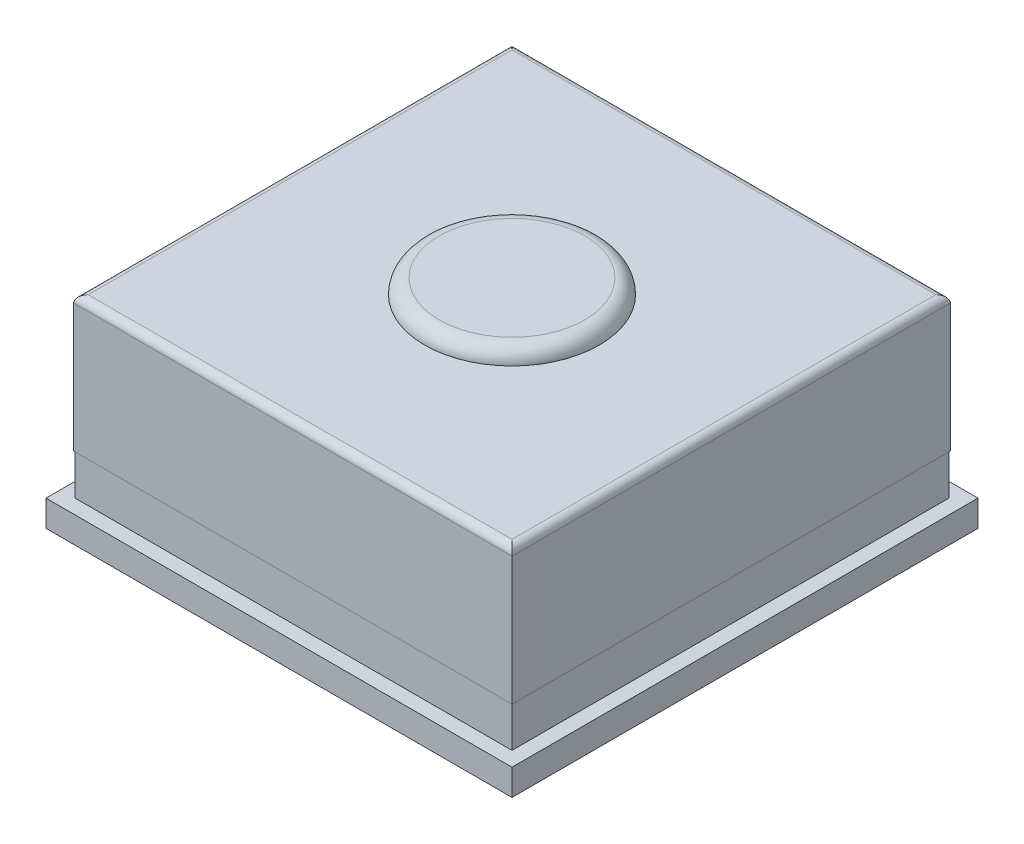
ISO-10303-21;
HEADER;
FILE_DESCRIPTION(('STEP AP214'),'2;1');
FILE_NAME('part.step','',(''),(''),'','','');
FILE_SCHEMA(('AUTOMOTIVE_DESIGN { 1 0 10303 214 1 1 1 1 }'));
ENDSEC;
DATA;
#1=APPLICATION_CONTEXT('core data for automotive mechanical design processes');
#2=APPLICATION_PROTOCOL_DEFINITION('international standard','automotive_design',2000,#1);
#3=PRODUCT_CONTEXT('',#1,'mechanical');
#4=PRODUCT('Part','Part','',(#3));
#5=PRODUCT_RELATED_PRODUCT_CATEGORY('part','',(#4));
#6=PRODUCT_DEFINITION_FORMATION('','',#4);
#7=PRODUCT_DEFINITION_CONTEXT('part definition',#1,'design');
#8=PRODUCT_DEFINITION('design','',#6,#7);
#9=PRODUCT_DEFINITION_SHAPE('','',#8);
#10=(LENGTH_UNIT() NAMED_UNIT(*) SI_UNIT(.MILLI.,.METRE.));
#11=(NAMED_UNIT(*) PLANE_ANGLE_UNIT() SI_UNIT($,.RADIAN.));
#12=(NAMED_UNIT(*) SI_UNIT($,.STERADIAN.) SOLID_ANGLE_UNIT());
#13=UNCERTAINTY_MEASURE_WITH_UNIT(LENGTH_MEASURE(1.E-05),#10,'distance_accuracy_value','');
#14=(GEOMETRIC_REPRESENTATION_CONTEXT(3) GLOBAL_UNCERTAINTY_ASSIGNED_CONTEXT((#13)) GLOBAL_UNIT_ASSIGNED_CONTEXT((#10,
#11,#12)) REPRESENTATION_CONTEXT('',''));
#15=CARTESIAN_POINT('',(0.,0.,0.));
#16=DIRECTION('',(0.,0.,1.));
#17=DIRECTION('',(1.,0.,0.));
#18=AXIS2_PLACEMENT_3D('',#15,#16,#17);
#19=CARTESIAN_POINT('',(0.,6.95,0.));
#20=DIRECTION('',(0.,-1.,0.));
#21=DIRECTION('',(0.,0.,-1.));
#22=AXIS2_PLACEMENT_3D('',#19,#20,#21);
#23=PLANE('',#22);
#24=DIRECTION('',(0.,0.,1.));
#25=VECTOR('',#24,1.);
#26=CARTESIAN_POINT('',(-7.275,6.95,0.));
#27=LINE('',#26,#25);
#28=CARTESIAN_POINT('',(-7.275,6.95,-7.275));
#29=VERTEX_POINT('',#28);
#30=CARTESIAN_POINT('',(-7.275,6.95,7.275));
#31=VERTEX_POINT('',#30);
#32=EDGE_CURVE('E238',#29,#31,#27,.T.);
#33=ORIENTED_EDGE('',*,*,#32,.T.);
#34=DIRECTION('',(1.,0.,0.));
#35=VECTOR('',#34,1.);
#36=CARTESIAN_POINT('',(0.,6.95,7.275));
#37=LINE('',#36,#35);
#38=CARTESIAN_POINT('',(7.275,6.95,7.275));
#39=VERTEX_POINT('',#38);
#40=EDGE_CURVE('E244',#31,#39,#37,.T.);
#41=ORIENTED_EDGE('',*,*,#40,.T.);
#42=DIRECTION('',(0.,0.,-1.));
#43=VECTOR('',#42,1.);
#44=CARTESIAN_POINT('',(7.275,6.95,0.));
#45=LINE('',#44,#43);
#46=CARTESIAN_POINT('',(7.275,6.95,-7.275));
#47=VERTEX_POINT('',#46);
#48=EDGE_CURVE('E242',#39,#47,#45,.T.);
#49=ORIENTED_EDGE('',*,*,#48,.T.);
#50=DIRECTION('',(-1.,0.,0.));
#51=VECTOR('',#50,1.);
#52=CARTESIAN_POINT('',(0.,6.95,-7.275));
#53=LINE('',#52,#51);
#54=EDGE_CURVE('E240',#47,#29,#53,.T.);
#55=ORIENTED_EDGE('',*,*,#54,.T.);
#56=EDGE_LOOP('',(#33,#41,#49,#55));
#57=FACE_BOUND('',#56,.T.);
#58=CARTESIAN_POINT('',(0.,6.95,0.));
#59=DIRECTION('',(0.,-1.,0.));
#60=DIRECTION('',(0.,0.,-1.));
#61=AXIS2_PLACEMENT_3D('',#58,#59,#60);
#62=CIRCLE('',#61,3.);
#63=CARTESIAN_POINT('',(0.,6.95,-3.));
#64=VERTEX_POINT('',#63);
#65=EDGE_CURVE('E232',#64,#64,#62,.F.);
#66=ORIENTED_EDGE('',*,*,#65,.F.);
#67=EDGE_LOOP('',(#66));
#68=FACE_BOUND('',#67,.T.);
#69=ADVANCED_FACE('F33',(#57,#68),#23,.F.);
#70=CARTESIAN_POINT('',(0.,0.9,0.));
#71=DIRECTION('',(0.,-1.,0.));
#72=DIRECTION('',(0.,0.,-1.));
#73=AXIS2_PLACEMENT_3D('',#70,#71,#72);
#74=PLANE('',#73);
#75=DIRECTION('',(0.,0.,-1.));
#76=VECTOR('',#75,1.);
#77=CARTESIAN_POINT('',(8.,0.9,8.));
#78=LINE('',#77,#76);
#79=CARTESIAN_POINT('',(8.,0.9,8.));
#80=VERTEX_POINT('',#79);
#81=CARTESIAN_POINT('',(8.,0.9,-8.));
#82=VERTEX_POINT('',#81);
#83=EDGE_CURVE('E203',#80,#82,#78,.T.);
#84=ORIENTED_EDGE('',*,*,#83,.T.);
#85=DIRECTION('',(-1.,0.,0.));
#86=VECTOR('',#85,1.);
#87=CARTESIAN_POINT('',(-8.,0.9,-8.));
#88=LINE('',#87,#86);
#89=CARTESIAN_POINT('',(-8.,0.9,-8.));
#90=VERTEX_POINT('',#89);
#91=EDGE_CURVE('E206',#82,#90,#88,.T.);
#92=ORIENTED_EDGE('',*,*,#91,.T.);
#93=DIRECTION('',(0.,0.,1.));
#94=VECTOR('',#93,1.);
#95=CARTESIAN_POINT('',(-8.,0.9,8.));
#96=LINE('',#95,#94);
#97=CARTESIAN_POINT('',(-8.,0.9,8.));
#98=VERTEX_POINT('',#97);
#99=EDGE_CURVE('E209',#90,#98,#96,.T.);
#100=ORIENTED_EDGE('',*,*,#99,.T.);
#101=DIRECTION('',(1.,0.,0.));
#102=VECTOR('',#101,1.);
#103=CARTESIAN_POINT('',(-8.,0.9,8.));
#104=LINE('',#103,#102);
#105=EDGE_CURVE('E211',#98,#80,#104,.T.);
#106=ORIENTED_EDGE('',*,*,#105,.T.);
#107=EDGE_LOOP('',(#84,#92,#100,#106));
#108=FACE_BOUND('',#107,.T.);
#109=DIRECTION('',(0.,0.,-1.));
#110=VECTOR('',#109,1.);
#111=CARTESIAN_POINT('',(7.5,0.9,0.));
#112=LINE('',#111,#110);
#113=CARTESIAN_POINT('',(7.5,0.9,7.5));
#114=VERTEX_POINT('',#113);
#115=CARTESIAN_POINT('',(7.5,0.9,-7.5));
#116=VERTEX_POINT('',#115);
#117=EDGE_CURVE('E199',#114,#116,#112,.T.);
#118=ORIENTED_EDGE('',*,*,#117,.F.);
#119=DIRECTION('',(1.,0.,0.));
#120=VECTOR('',#119,1.);
#121=CARTESIAN_POINT('',(0.,0.9,7.5));
#122=LINE('',#121,#120);
#123=CARTESIAN_POINT('',(-7.5,0.9,7.5));
#124=VERTEX_POINT('',#123);
#125=EDGE_CURVE('E190',#124,#114,#122,.T.);
#126=ORIENTED_EDGE('',*,*,#125,.F.);
#127=DIRECTION('',(0.,0.,1.));
#128=VECTOR('',#127,1.);
#129=CARTESIAN_POINT('',(-7.5,0.9,0.));
#130=LINE('',#129,#128);
#131=CARTESIAN_POINT('',(-7.5,0.9,-7.5));
#132=VERTEX_POINT('',#131);
#133=EDGE_CURVE('E193',#132,#124,#130,.T.);
#134=ORIENTED_EDGE('',*,*,#133,.F.);
#135=DIRECTION('',(-1.,0.,0.));
#136=VECTOR('',#135,1.);
#137=CARTESIAN_POINT('',(0.,0.9,-7.5));
#138=LINE('',#137,#136);
#139=EDGE_CURVE('E196',#116,#132,#138,.T.);
#140=ORIENTED_EDGE('',*,*,#139,.F.);
#141=EDGE_LOOP('',(#118,#126,#134,#140));
#142=FACE_BOUND('',#141,.T.);
#143=ADVANCED_FACE('F286',(#108,#142),#74,.F.);
#144=CARTESIAN_POINT('',(8.,0.9,8.));
#145=DIRECTION('',(-1.,0.,0.));
#146=DIRECTION('',(0.,0.,1.));
#147=AXIS2_PLACEMENT_3D('',#144,#145,#146);
#148=PLANE('',#147);
#149=DIRECTION('',(0.,0.,-1.));
#150=VECTOR('',#149,1.);
#151=CARTESIAN_POINT('',(8.,0.,8.));
#152=LINE('',#151,#150);
#153=CARTESIAN_POINT('',(8.,0.,8.));
#154=VERTEX_POINT('',#153);
#155=CARTESIAN_POINT('',(8.,0.,-8.));
#156=VERTEX_POINT('',#155);
#157=EDGE_CURVE('E202',#154,#156,#152,.T.);
#158=ORIENTED_EDGE('',*,*,#157,.T.);
#159=DIRECTION('',(0.,-1.,0.));
#160=VECTOR('',#159,1.);
#161=CARTESIAN_POINT('',(8.,0.9,-8.));
#162=LINE('',#161,#160);
#163=EDGE_CURVE('E229',#82,#156,#162,.T.);
#164=ORIENTED_EDGE('',*,*,#163,.F.);
#165=ORIENTED_EDGE('',*,*,#83,.F.);
#166=DIRECTION('',(0.,-1.,0.));
#167=VECTOR('',#166,1.);
#168=CARTESIAN_POINT('',(8.,0.9,8.));
#169=LINE('',#168,#167);
#170=EDGE_CURVE('E213',#80,#154,#169,.T.);
#171=ORIENTED_EDGE('',*,*,#170,.T.);
#172=EDGE_LOOP('',(#158,#164,#165,#171));
#173=FACE_BOUND('',#172,.T.);
#174=ADVANCED_FACE('F291',(#173),#148,.F.);
#175=CARTESIAN_POINT('',(-8.,0.9,-8.));
#176=DIRECTION('',(0.,0.,1.));
#177=DIRECTION('',(1.,0.,0.));
#178=AXIS2_PLACEMENT_3D('',#175,#176,#177);
#179=PLANE('',#178);
#180=DIRECTION('',(-1.,0.,0.));
#181=VECTOR('',#180,1.);
#182=CARTESIAN_POINT('',(-8.,0.,-8.));
#183=LINE('',#182,#181);
#184=CARTESIAN_POINT('',(-8.,0.,-8.));
#185=VERTEX_POINT('',#184);
#186=EDGE_CURVE('E216',#156,#185,#183,.T.);
#187=ORIENTED_EDGE('',*,*,#186,.T.);
#188=DIRECTION('',(0.,-1.,0.));
#189=VECTOR('',#188,1.);
#190=CARTESIAN_POINT('',(-8.,0.9,-8.));
#191=LINE('',#190,#189);
#192=EDGE_CURVE('E226',#90,#185,#191,.T.);
#193=ORIENTED_EDGE('',*,*,#192,.F.);
#194=ORIENTED_EDGE('',*,*,#91,.F.);
#195=ORIENTED_EDGE('',*,*,#163,.T.);
#196=EDGE_LOOP('',(#187,#193,#194,#195));
#197=FACE_BOUND('',#196,.T.);
#198=ADVANCED_FACE('F331',(#197),#179,.F.);
#199=CARTESIAN_POINT('',(-8.,0.9,8.));
#200=DIRECTION('',(1.,0.,0.));
#201=DIRECTION('',(0.,0.,-1.));
#202=AXIS2_PLACEMENT_3D('',#199,#200,#201);
#203=PLANE('',#202);
#204=DIRECTION('',(0.,0.,1.));
#205=VECTOR('',#204,1.);
#206=CARTESIAN_POINT('',(-8.,0.,8.));
#207=LINE('',#206,#205);
#208=CARTESIAN_POINT('',(-8.,0.,8.));
#209=VERTEX_POINT('',#208);
#210=EDGE_CURVE('E218',#185,#209,#207,.T.);
#211=ORIENTED_EDGE('',*,*,#210,.T.);
#212=DIRECTION('',(0.,-1.,0.));
#213=VECTOR('',#212,1.);
#214=CARTESIAN_POINT('',(-8.,0.9,8.));
#215=LINE('',#214,#213);
#216=EDGE_CURVE('E223',#98,#209,#215,.T.);
#217=ORIENTED_EDGE('',*,*,#216,.F.);
#218=ORIENTED_EDGE('',*,*,#99,.F.);
#219=ORIENTED_EDGE('',*,*,#192,.T.);
#220=EDGE_LOOP('',(#211,#217,#218,#219));
#221=FACE_BOUND('',#220,.T.);
#222=ADVANCED_FACE('F327',(#221),#203,.F.);
#223=CARTESIAN_POINT('',(-8.,0.9,8.));
#224=DIRECTION('',(0.,0.,-1.));
#225=DIRECTION('',(-1.,0.,0.));
#226=AXIS2_PLACEMENT_3D('',#223,#224,#225);
#227=PLANE('',#226);
#228=DIRECTION('',(1.,0.,0.));
#229=VECTOR('',#228,1.);
#230=CARTESIAN_POINT('',(-8.,0.,8.));
#231=LINE('',#230,#229);
#232=EDGE_CURVE('E207',#209,#154,#231,.T.);
#233=ORIENTED_EDGE('',*,*,#232,.T.);
#234=ORIENTED_EDGE('',*,*,#170,.F.);
#235=ORIENTED_EDGE('',*,*,#105,.F.);
#236=ORIENTED_EDGE('',*,*,#216,.T.);
#237=EDGE_LOOP('',(#233,#234,#235,#236));
#238=FACE_BOUND('',#237,.T.);
#239=ADVANCED_FACE('F323',(#238),#227,.F.);
#240=CARTESIAN_POINT('',(0.,0.,0.));
#241=DIRECTION('',(0.,-1.,0.));
#242=DIRECTION('',(0.,0.,-1.));
#243=AXIS2_PLACEMENT_3D('',#240,#241,#242);
#244=PLANE('',#243);
#245=ORIENTED_EDGE('',*,*,#157,.F.);
#246=ORIENTED_EDGE('',*,*,#232,.F.);
#247=ORIENTED_EDGE('',*,*,#210,.F.);
#248=ORIENTED_EDGE('',*,*,#186,.F.);
#249=EDGE_LOOP('',(#245,#246,#247,#248));
#250=FACE_BOUND('',#249,.T.);
#251=ADVANCED_FACE('F318',(#250),#244,.T.);
#252=CARTESIAN_POINT('',(7.5,2.3,7.5));
#253=DIRECTION('',(-1.,0.,0.));
#254=DIRECTION('',(0.,0.,1.));
#255=AXIS2_PLACEMENT_3D('',#252,#253,#254);
#256=PLANE('',#255);
#257=DIRECTION('',(0.,-1.,0.));
#258=VECTOR('',#257,1.);
#259=CARTESIAN_POINT('',(7.5,2.3,7.5));
#260=LINE('',#259,#258);
#261=CARTESIAN_POINT('',(7.5,2.3,7.5));
#262=VERTEX_POINT('',#261);
#263=EDGE_CURVE('E178',#262,#114,#260,.T.);
#264=ORIENTED_EDGE('',*,*,#263,.T.);
#265=ORIENTED_EDGE('',*,*,#117,.T.);
#266=DIRECTION('',(0.,-1.,0.));
#267=VECTOR('',#266,1.);
#268=CARTESIAN_POINT('',(7.5,2.3,-7.5));
#269=LINE('',#268,#267);
#270=CARTESIAN_POINT('',(7.5,2.3,-7.5));
#271=VERTEX_POINT('',#270);
#272=EDGE_CURVE('E187',#271,#116,#269,.T.);
#273=ORIENTED_EDGE('',*,*,#272,.F.);
#274=DIRECTION('',(0.,0.,-1.));
#275=VECTOR('',#274,1.);
#276=CARTESIAN_POINT('',(7.5,2.3,7.5));
#277=LINE('',#276,#275);
#278=EDGE_CURVE('E140',#262,#271,#277,.T.);
#279=ORIENTED_EDGE('',*,*,#278,.F.);
#280=EDGE_LOOP('',(#264,#265,#273,#279));
#281=FACE_BOUND('',#280,.T.);
#282=ADVANCED_FACE('F315',(#281),#256,.F.);
#283=CARTESIAN_POINT('',(-7.5,2.3,-7.5));
#284=DIRECTION('',(0.,0.,1.));
#285=DIRECTION('',(1.,0.,0.));
#286=AXIS2_PLACEMENT_3D('',#283,#284,#285);
#287=PLANE('',#286);
#288=ORIENTED_EDGE('',*,*,#272,.T.);
#289=ORIENTED_EDGE('',*,*,#139,.T.);
#290=DIRECTION('',(0.,-1.,0.));
#291=VECTOR('',#290,1.);
#292=CARTESIAN_POINT('',(-7.5,2.3,-7.5));
#293=LINE('',#292,#291);
#294=CARTESIAN_POINT('',(-7.5,2.3,-7.5));
#295=VERTEX_POINT('',#294);
#296=EDGE_CURVE('E184',#295,#132,#293,.T.);
#297=ORIENTED_EDGE('',*,*,#296,.F.);
#298=DIRECTION('',(-1.,0.,0.));
#299=VECTOR('',#298,1.);
#300=CARTESIAN_POINT('',(-7.5,2.3,-7.5));
#301=LINE('',#300,#299);
#302=EDGE_CURVE('E169',#271,#295,#301,.T.);
#303=ORIENTED_EDGE('',*,*,#302,.F.);
#304=EDGE_LOOP('',(#288,#289,#297,#303));
#305=FACE_BOUND('',#304,.T.);
#306=ADVANCED_FACE('F309',(#305),#287,.F.);
#307=CARTESIAN_POINT('',(-7.5,2.3,7.5));
#308=DIRECTION('',(1.,0.,0.));
#309=DIRECTION('',(0.,0.,-1.));
#310=AXIS2_PLACEMENT_3D('',#307,#308,#309);
#311=PLANE('',#310);
#312=ORIENTED_EDGE('',*,*,#296,.T.);
#313=ORIENTED_EDGE('',*,*,#133,.T.);
#314=DIRECTION('',(0.,-1.,0.));
#315=VECTOR('',#314,1.);
#316=CARTESIAN_POINT('',(-7.5,2.3,7.5));
#317=LINE('',#316,#315);
#318=CARTESIAN_POINT('',(-7.5,2.3,7.5));
#319=VERTEX_POINT('',#318);
#320=EDGE_CURVE('E181',#319,#124,#317,.T.);
#321=ORIENTED_EDGE('',*,*,#320,.F.);
#322=DIRECTION('',(0.,0.,1.));
#323=VECTOR('',#322,1.);
#324=CARTESIAN_POINT('',(-7.5,2.3,7.5));
#325=LINE('',#324,#323);
#326=EDGE_CURVE('E172',#295,#319,#325,.T.);
#327=ORIENTED_EDGE('',*,*,#326,.F.);
#328=EDGE_LOOP('',(#312,#313,#321,#327));
#329=FACE_BOUND('',#328,.T.);
#330=ADVANCED_FACE('F303',(#329),#311,.F.);
#331=CARTESIAN_POINT('',(-7.5,2.3,7.5));
#332=DIRECTION('',(0.,0.,-1.));
#333=DIRECTION('',(-1.,0.,0.));
#334=AXIS2_PLACEMENT_3D('',#331,#332,#333);
#335=PLANE('',#334);
#336=ORIENTED_EDGE('',*,*,#320,.T.);
#337=ORIENTED_EDGE('',*,*,#125,.T.);
#338=ORIENTED_EDGE('',*,*,#263,.F.);
#339=DIRECTION('',(1.,0.,0.));
#340=VECTOR('',#339,1.);
#341=CARTESIAN_POINT('',(-7.5,2.3,7.5));
#342=LINE('',#341,#340);
#343=EDGE_CURVE('E175',#319,#262,#342,.T.);
#344=ORIENTED_EDGE('',*,*,#343,.F.);
#345=EDGE_LOOP('',(#336,#337,#338,#344));
#346=FACE_BOUND('',#345,.T.);
#347=ADVANCED_FACE('F297',(#346),#335,.F.);
#348=CARTESIAN_POINT('',(0.,2.3,0.));
#349=DIRECTION('',(0.,-1.,0.));
#350=DIRECTION('',(0.,0.,-1.));
#351=AXIS2_PLACEMENT_3D('',#348,#349,#350);
#352=PLANE('',#351);
#353=DIRECTION('',(0.,0.,-1.));
#354=VECTOR('',#353,1.);
#355=CARTESIAN_POINT('',(7.525,2.3,7.525));
#356=LINE('',#355,#354);
#357=CARTESIAN_POINT('',(7.525,2.3,7.525));
#358=VERTEX_POINT('',#357);
#359=CARTESIAN_POINT('',(7.525,2.3,-7.525));
#360=VERTEX_POINT('',#359);
#361=EDGE_CURVE('E148',#358,#360,#356,.T.);
#362=ORIENTED_EDGE('',*,*,#361,.F.);
#363=DIRECTION('',(1.,0.,0.));
#364=VECTOR('',#363,1.);
#365=CARTESIAN_POINT('',(-7.525,2.3,7.525));
#366=LINE('',#365,#364);
#367=CARTESIAN_POINT('',(-7.525,2.3,7.525));
#368=VERTEX_POINT('',#367);
#369=EDGE_CURVE('E161',#368,#358,#366,.T.);
#370=ORIENTED_EDGE('',*,*,#369,.F.);
#371=DIRECTION('',(0.,0.,1.));
#372=VECTOR('',#371,1.);
#373=CARTESIAN_POINT('',(-7.525,2.3,7.525));
#374=LINE('',#373,#372);
#375=CARTESIAN_POINT('',(-7.525,2.3,-7.525));
#376=VERTEX_POINT('',#375);
#377=EDGE_CURVE('E150',#376,#368,#374,.T.);
#378=ORIENTED_EDGE('',*,*,#377,.F.);
#379=DIRECTION('',(-1.,0.,0.));
#380=VECTOR('',#379,1.);
#381=CARTESIAN_POINT('',(-7.525,2.3,-7.525));
#382=LINE('',#381,#380);
#383=EDGE_CURVE('E135',#360,#376,#382,.T.);
#384=ORIENTED_EDGE('',*,*,#383,.F.);
#385=EDGE_LOOP('',(#362,#370,#378,#384));
#386=FACE_BOUND('',#385,.T.);
#387=ORIENTED_EDGE('',*,*,#278,.T.);
#388=ORIENTED_EDGE('',*,*,#302,.T.);
#389=ORIENTED_EDGE('',*,*,#326,.T.);
#390=ORIENTED_EDGE('',*,*,#343,.T.);
#391=EDGE_LOOP('',(#387,#388,#389,#390));
#392=FACE_BOUND('',#391,.T.);
#393=ADVANCED_FACE('F145',(#386,#392),#352,.T.);
#394=CARTESIAN_POINT('',(7.525,6.95,7.525));
#395=DIRECTION('',(-1.,0.,0.));
#396=DIRECTION('',(0.,0.,1.));
#397=AXIS2_PLACEMENT_3D('',#394,#395,#396);
#398=PLANE('',#397);
#399=DIRECTION('',(0.,-1.,0.));
#400=VECTOR('',#399,1.);
#401=CARTESIAN_POINT('',(7.525,6.95,-7.525));
#402=LINE('',#401,#400);
#403=CARTESIAN_POINT('',(7.525,6.7,-7.525));
#404=VERTEX_POINT('',#403);
#405=EDGE_CURVE('E132',#404,#360,#402,.T.);
#406=ORIENTED_EDGE('',*,*,#405,.F.);
#407=DIRECTION('',(0.,0.,-1.));
#408=VECTOR('',#407,1.);
#409=CARTESIAN_POINT('',(7.525,6.7,7.525));
#410=LINE('',#409,#408);
#411=CARTESIAN_POINT('',(7.525,6.7,7.525));
#412=VERTEX_POINT('',#411);
#413=EDGE_CURVE('E250',#404,#412,#410,.F.);
#414=ORIENTED_EDGE('',*,*,#413,.T.);
#415=DIRECTION('',(0.,-1.,0.));
#416=VECTOR('',#415,1.);
#417=CARTESIAN_POINT('',(7.525,6.95,7.525));
#418=LINE('',#417,#416);
#419=EDGE_CURVE('E154',#412,#358,#418,.T.);
#420=ORIENTED_EDGE('',*,*,#419,.T.);
#421=ORIENTED_EDGE('',*,*,#361,.T.);
#422=EDGE_LOOP('',(#406,#414,#420,#421));
#423=FACE_BOUND('',#422,.T.);
#424=ADVANCED_FACE('F152',(#423),#398,.F.);
#425=CARTESIAN_POINT('',(-7.525,6.95,-7.525));
#426=DIRECTION('',(0.,0.,1.));
#427=DIRECTION('',(1.,0.,0.));
#428=AXIS2_PLACEMENT_3D('',#425,#426,#427);
#429=PLANE('',#428);
#430=DIRECTION('',(0.,-1.,0.));
#431=VECTOR('',#430,1.);
#432=CARTESIAN_POINT('',(-7.525,6.95,-7.525));
#433=LINE('',#432,#431);
#434=CARTESIAN_POINT('',(-7.525,6.7,-7.525));
#435=VERTEX_POINT('',#434);
#436=EDGE_CURVE('E141',#435,#376,#433,.T.);
#437=ORIENTED_EDGE('',*,*,#436,.F.);
#438=DIRECTION('',(-1.,0.,0.));
#439=VECTOR('',#438,1.);
#440=CARTESIAN_POINT('',(-7.525,6.7,-7.525));
#441=LINE('',#440,#439);
#442=EDGE_CURVE('E42',#435,#404,#441,.F.);
#443=ORIENTED_EDGE('',*,*,#442,.T.);
#444=ORIENTED_EDGE('',*,*,#405,.T.);
#445=ORIENTED_EDGE('',*,*,#383,.T.);
#446=EDGE_LOOP('',(#437,#443,#444,#445));
#447=FACE_BOUND('',#446,.T.);
#448=ADVANCED_FACE('F134',(#447),#429,.F.);
#449=CARTESIAN_POINT('',(-7.525,6.95,7.525));
#450=DIRECTION('',(1.,0.,0.));
#451=DIRECTION('',(0.,0.,-1.));
#452=AXIS2_PLACEMENT_3D('',#449,#450,#451);
#453=PLANE('',#452);
#454=DIRECTION('',(0.,-1.,0.));
#455=VECTOR('',#454,1.);
#456=CARTESIAN_POINT('',(-7.525,6.95,7.525));
#457=LINE('',#456,#455);
#458=CARTESIAN_POINT('',(-7.525,6.7,7.525));
#459=VERTEX_POINT('',#458);
#460=EDGE_CURVE('E164',#459,#368,#457,.T.);
#461=ORIENTED_EDGE('',*,*,#460,.F.);
#462=DIRECTION('',(0.,0.,1.));
#463=VECTOR('',#462,1.);
#464=CARTESIAN_POINT('',(-7.525,6.7,7.525));
#465=LINE('',#464,#463);
#466=EDGE_CURVE('E11',#459,#435,#465,.F.);
#467=ORIENTED_EDGE('',*,*,#466,.T.);
#468=ORIENTED_EDGE('',*,*,#436,.T.);
#469=ORIENTED_EDGE('',*,*,#377,.T.);
#470=EDGE_LOOP('',(#461,#467,#468,#469));
#471=FACE_BOUND('',#470,.T.);
#472=ADVANCED_FACE('F275',(#471),#453,.F.);
#473=CARTESIAN_POINT('',(-7.525,6.95,7.525));
#474=DIRECTION('',(0.,0.,-1.));
#475=DIRECTION('',(-1.,0.,0.));
#476=AXIS2_PLACEMENT_3D('',#473,#474,#475);
#477=PLANE('',#476);
#478=ORIENTED_EDGE('',*,*,#419,.F.);
#479=DIRECTION('',(1.,0.,0.));
#480=VECTOR('',#479,1.);
#481=CARTESIAN_POINT('',(-7.525,6.7,7.525));
#482=LINE('',#481,#480);
#483=EDGE_CURVE('E247',#412,#459,#482,.F.);
#484=ORIENTED_EDGE('',*,*,#483,.T.);
#485=ORIENTED_EDGE('',*,*,#460,.T.);
#486=ORIENTED_EDGE('',*,*,#369,.T.);
#487=EDGE_LOOP('',(#478,#484,#485,#486));
#488=FACE_BOUND('',#487,.T.);
#489=ADVANCED_FACE('F274',(#488),#477,.F.);
#490=CARTESIAN_POINT('',(0.,7.45,0.));
#491=DIRECTION('',(0.,1.,0.));
#492=DIRECTION('',(0.,0.,1.));
#493=AXIS2_PLACEMENT_3D('',#490,#491,#492);
#494=PLANE('',#493);
#495=CARTESIAN_POINT('',(0.,7.45,0.));
#496=DIRECTION('',(0.,1.,0.));
#497=DIRECTION('',(0.,0.,1.));
#498=AXIS2_PLACEMENT_3D('',#495,#496,#497);
#499=CIRCLE('',#498,2.5);
#500=CARTESIAN_POINT('',(0.,7.45,2.5));
#501=VERTEX_POINT('',#500);
#502=EDGE_CURVE('E235',#501,#501,#499,.T.);
#503=ORIENTED_EDGE('',*,*,#502,.T.);
#504=EDGE_LOOP('',(#503));
#505=FACE_BOUND('',#504,.T.);
#506=ADVANCED_FACE('F282',(#505),#494,.T.);
#507=CARTESIAN_POINT('',(0.,6.95,0.));
#508=DIRECTION('',(0.,1.,0.));
#509=DIRECTION('',(0.,0.,1.));
#510=AXIS2_PLACEMENT_3D('',#507,#508,#509);
#511=TOROIDAL_SURFACE('',#510,2.5,0.5);
#512=ORIENTED_EDGE('',*,*,#65,.T.);
#513=EDGE_LOOP('',(#512));
#514=FACE_BOUND('',#513,.T.);
#515=ORIENTED_EDGE('',*,*,#502,.F.);
#516=EDGE_LOOP('',(#515));
#517=FACE_BOUND('',#516,.T.);
#518=ADVANCED_FACE('F339',(#514,#517),#511,.T.);
#519=CARTESIAN_POINT('',(0.,6.7,-7.275));
#520=DIRECTION('',(-1.,0.,0.));
#521=DIRECTION('',(0.,0.,1.));
#522=AXIS2_PLACEMENT_3D('',#519,#520,#521);
#523=CYLINDRICAL_SURFACE('',#522,0.25);
#524=CARTESIAN_POINT('',(7.275,6.7,-7.275));
#525=DIRECTION('',(-0.707106781186547,0.,-0.707106781186547));
#526=DIRECTION('',(-0.707106781186547,0.,0.707106781186547));
#527=AXIS2_PLACEMENT_3D('',#524,#525,#526);
#528=ELLIPSE('',#527,0.353553390593274,0.25);
#529=EDGE_CURVE('E158',#404,#47,#528,.F.);
#530=ORIENTED_EDGE('',*,*,#529,.F.);
#531=ORIENTED_EDGE('',*,*,#442,.F.);
#532=CARTESIAN_POINT('',(-7.275,6.7,-7.275));
#533=DIRECTION('',(-0.707106781186547,0.,0.707106781186547));
#534=DIRECTION('',(0.707106781186547,0.,0.707106781186547));
#535=AXIS2_PLACEMENT_3D('',#532,#533,#534);
#536=ELLIPSE('',#535,0.353553390593274,0.25);
#537=EDGE_CURVE('E37',#29,#435,#536,.T.);
#538=ORIENTED_EDGE('',*,*,#537,.F.);
#539=ORIENTED_EDGE('',*,*,#54,.F.);
#540=EDGE_LOOP('',(#530,#531,#538,#539));
#541=FACE_BOUND('',#540,.T.);
#542=ADVANCED_FACE('F35',(#541),#523,.T.);
#543=CARTESIAN_POINT('',(-7.275,6.7,0.));
#544=DIRECTION('',(0.,0.,1.));
#545=DIRECTION('',(1.,0.,0.));
#546=AXIS2_PLACEMENT_3D('',#543,#544,#545);
#547=CYLINDRICAL_SURFACE('',#546,0.25);
#548=ORIENTED_EDGE('',*,*,#537,.T.);
#549=ORIENTED_EDGE('',*,*,#466,.F.);
#550=CARTESIAN_POINT('',(-7.275,6.7,7.275));
#551=DIRECTION('',(0.707106781186547,0.,0.707106781186547));
#552=DIRECTION('',(-0.707106781186547,0.,0.707106781186547));
#553=AXIS2_PLACEMENT_3D('',#550,#551,#552);
#554=ELLIPSE('',#553,0.353553390593274,0.25);
#555=EDGE_CURVE('E255',#31,#459,#554,.T.);
#556=ORIENTED_EDGE('',*,*,#555,.F.);
#557=ORIENTED_EDGE('',*,*,#32,.F.);
#558=EDGE_LOOP('',(#548,#549,#556,#557));
#559=FACE_BOUND('',#558,.T.);
#560=ADVANCED_FACE('F346',(#559),#547,.T.);
#561=CARTESIAN_POINT('',(7.275,6.7,0.));
#562=DIRECTION('',(0.,0.,-1.));
#563=DIRECTION('',(-1.,0.,0.));
#564=AXIS2_PLACEMENT_3D('',#561,#562,#563);
#565=CYLINDRICAL_SURFACE('',#564,0.25);
#566=ORIENTED_EDGE('',*,*,#529,.T.);
#567=ORIENTED_EDGE('',*,*,#48,.F.);
#568=CARTESIAN_POINT('',(7.275,6.7,7.275));
#569=DIRECTION('',(0.707106781186547,0.,-0.707106781186547));
#570=DIRECTION('',(-0.707106781186547,0.,-0.707106781186547));
#571=AXIS2_PLACEMENT_3D('',#568,#569,#570);
#572=ELLIPSE('',#571,0.353553390593274,0.25);
#573=EDGE_CURVE('E253',#412,#39,#572,.F.);
#574=ORIENTED_EDGE('',*,*,#573,.F.);
#575=ORIENTED_EDGE('',*,*,#413,.F.);
#576=EDGE_LOOP('',(#566,#567,#574,#575));
#577=FACE_BOUND('',#576,.T.);
#578=ADVANCED_FACE('F260',(#577),#565,.T.);
#579=CARTESIAN_POINT('',(0.,6.7,7.275));
#580=DIRECTION('',(1.,0.,0.));
#581=DIRECTION('',(0.,0.,-1.));
#582=AXIS2_PLACEMENT_3D('',#579,#580,#581);
#583=CYLINDRICAL_SURFACE('',#582,0.25);
#584=ORIENTED_EDGE('',*,*,#555,.T.);
#585=ORIENTED_EDGE('',*,*,#483,.F.);
#586=ORIENTED_EDGE('',*,*,#573,.T.);
#587=ORIENTED_EDGE('',*,*,#40,.F.);
#588=EDGE_LOOP('',(#584,#585,#586,#587));
#589=FACE_BOUND('',#588,.T.);
#590=ADVANCED_FACE('F271',(#589),#583,.T.);
#591=CLOSED_SHELL('',(#69,#143,#174,#198,#222,#239,#251,#282,#306,#330,#347,#393,#424,#448,#472,
#489,#506,#518,#542,#560,#578,#590));
#592=MANIFOLD_SOLID_BREP('B2',#591);
#593=ADVANCED_BREP_SHAPE_REPRESENTATION('',(#18,#592),#14);
#594=SHAPE_DEFINITION_REPRESENTATION(#9,#593);
ENDSEC;
END-ISO-10303-21;
